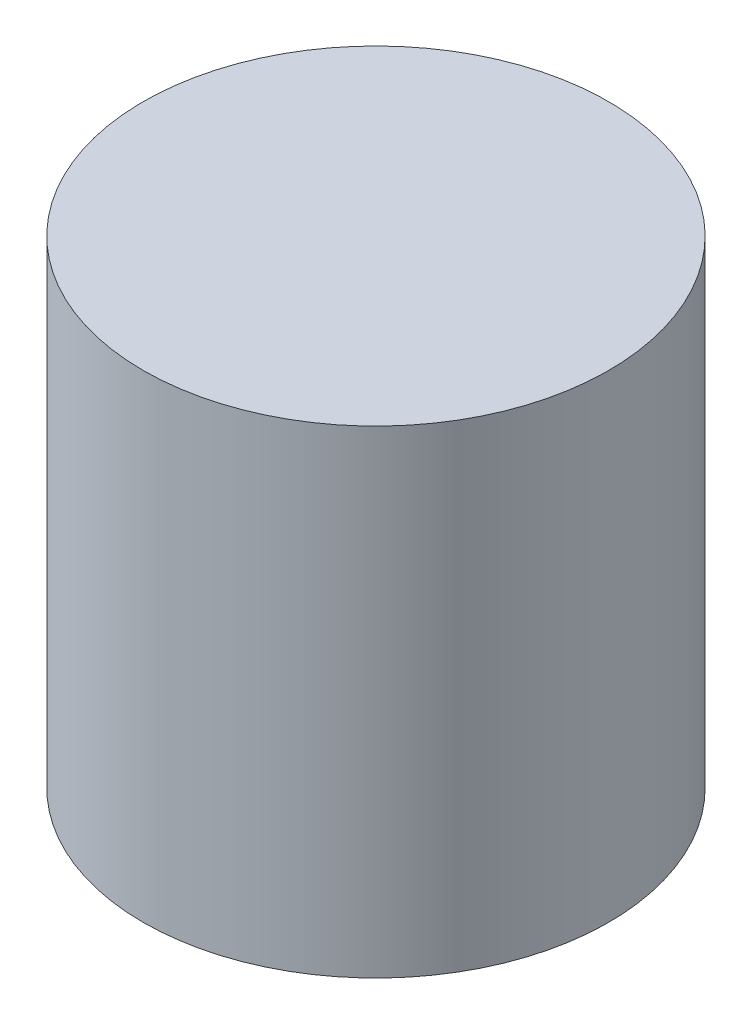
ISO-10303-21;
HEADER;
FILE_DESCRIPTION(('STEP AP214'),'2;1');
FILE_NAME('part.step','',(''),(''),'','','');
FILE_SCHEMA(('AUTOMOTIVE_DESIGN { 1 0 10303 214 1 1 1 1 }'));
ENDSEC;
DATA;
#1=APPLICATION_CONTEXT('core data for automotive mechanical design processes');
#2=APPLICATION_PROTOCOL_DEFINITION('international standard','automotive_design',2000,#1);
#3=PRODUCT_CONTEXT('',#1,'mechanical');
#4=PRODUCT('Part','Part','',(#3));
#5=PRODUCT_RELATED_PRODUCT_CATEGORY('part','',(#4));
#6=PRODUCT_DEFINITION_FORMATION('','',#4);
#7=PRODUCT_DEFINITION_CONTEXT('part definition',#1,'design');
#8=PRODUCT_DEFINITION('design','',#6,#7);
#9=PRODUCT_DEFINITION_SHAPE('','',#8);
#10=(LENGTH_UNIT() NAMED_UNIT(*) SI_UNIT(.MILLI.,.METRE.));
#11=(NAMED_UNIT(*) PLANE_ANGLE_UNIT() SI_UNIT($,.RADIAN.));
#12=(NAMED_UNIT(*) SI_UNIT($,.STERADIAN.) SOLID_ANGLE_UNIT());
#13=UNCERTAINTY_MEASURE_WITH_UNIT(LENGTH_MEASURE(1.E-05),#10,'distance_accuracy_value','');
#14=(GEOMETRIC_REPRESENTATION_CONTEXT(3) GLOBAL_UNCERTAINTY_ASSIGNED_CONTEXT((#13)) GLOBAL_UNIT_ASSIGNED_CONTEXT((#10,
#11,#12)) REPRESENTATION_CONTEXT('',''));
#15=CARTESIAN_POINT('',(0.,0.,0.));
#16=DIRECTION('',(0.,0.,1.));
#17=DIRECTION('',(1.,0.,0.));
#18=AXIS2_PLACEMENT_3D('',#15,#16,#17);
#19=CARTESIAN_POINT('',(0.,584.2,0.));
#20=DIRECTION('',(0.,-1.,0.));
#21=DIRECTION('',(0.,0.,-1.));
#22=AXIS2_PLACEMENT_3D('',#19,#20,#21);
#23=CYLINDRICAL_SURFACE('',#22,284.48000000009);
#24=CARTESIAN_POINT('',(0.,584.2,0.));
#25=DIRECTION('',(0.,1.,0.));
#26=DIRECTION('',(0.,0.,1.));
#27=AXIS2_PLACEMENT_3D('',#24,#25,#26);
#28=CIRCLE('',#27,284.48000000009);
#29=CARTESIAN_POINT('',(0.,584.2,284.48000000009));
#30=VERTEX_POINT('',#29);
#31=EDGE_CURVE('E10',#30,#30,#28,.T.);
#32=ORIENTED_EDGE('',*,*,#31,.F.);
#33=EDGE_LOOP('',(#32));
#34=FACE_BOUND('',#33,.T.);
#35=CARTESIAN_POINT('',(0.,0.,0.));
#36=DIRECTION('',(0.,1.,0.));
#37=DIRECTION('',(0.,0.,1.));
#38=AXIS2_PLACEMENT_3D('',#35,#36,#37);
#39=CIRCLE('',#38,284.48000000009);
#40=CARTESIAN_POINT('',(0.,0.,284.48000000009));
#41=VERTEX_POINT('',#40);
#42=EDGE_CURVE('E38',#41,#41,#39,.T.);
#43=ORIENTED_EDGE('',*,*,#42,.T.);
#44=EDGE_LOOP('',(#43));
#45=FACE_BOUND('',#44,.T.);
#46=ADVANCED_FACE('F35',(#34,#45),#23,.T.);
#47=CARTESIAN_POINT('',(0.,584.2,0.));
#48=DIRECTION('',(0.,1.,0.));
#49=DIRECTION('',(0.,0.,1.));
#50=AXIS2_PLACEMENT_3D('',#47,#48,#49);
#51=PLANE('',#50);
#52=ORIENTED_EDGE('',*,*,#31,.T.);
#53=EDGE_LOOP('',(#52));
#54=FACE_BOUND('',#53,.T.);
#55=ADVANCED_FACE('F64',(#54),#51,.T.);
#56=CARTESIAN_POINT('',(0.,0.,0.));
#57=DIRECTION('',(0.,1.,0.));
#58=DIRECTION('',(0.,0.,1.));
#59=AXIS2_PLACEMENT_3D('',#56,#57,#58);
#60=PLANE('',#59);
#61=CARTESIAN_POINT('',(0.,0.,0.));
#62=DIRECTION('',(0.,-1.,0.));
#63=DIRECTION('',(0.,0.,-1.));
#64=AXIS2_PLACEMENT_3D('',#61,#62,#63);
#65=CIRCLE('',#64,279.4);
#66=CARTESIAN_POINT('',(0.,0.,-279.4));
#67=VERTEX_POINT('',#66);
#68=EDGE_CURVE('E47',#67,#67,#65,.T.);
#69=ORIENTED_EDGE('',*,*,#68,.F.);
#70=EDGE_LOOP('',(#69));
#71=FACE_BOUND('',#70,.T.);
#72=ORIENTED_EDGE('',*,*,#42,.F.);
#73=EDGE_LOOP('',(#72));
#74=FACE_BOUND('',#73,.T.);
#75=ADVANCED_FACE('F58',(#71,#74),#60,.F.);
#76=CARTESIAN_POINT('',(0.,558.8,0.));
#77=DIRECTION('',(0.,-1.,0.));
#78=DIRECTION('',(0.,0.,-1.));
#79=AXIS2_PLACEMENT_3D('',#76,#77,#78);
#80=CYLINDRICAL_SURFACE('',#79,279.4);
#81=CARTESIAN_POINT('',(0.,558.8,0.));
#82=DIRECTION('',(0.,-1.,0.));
#83=DIRECTION('',(0.,0.,-1.));
#84=AXIS2_PLACEMENT_3D('',#81,#82,#83);
#85=CIRCLE('',#84,279.4);
#86=CARTESIAN_POINT('',(0.,558.8,-279.4));
#87=VERTEX_POINT('',#86);
#88=EDGE_CURVE('E45',#87,#87,#85,.T.);
#89=ORIENTED_EDGE('',*,*,#88,.F.);
#90=EDGE_LOOP('',(#89));
#91=FACE_BOUND('',#90,.T.);
#92=ORIENTED_EDGE('',*,*,#68,.T.);
#93=EDGE_LOOP('',(#92));
#94=FACE_BOUND('',#93,.T.);
#95=ADVANCED_FACE('F55',(#91,#94),#80,.F.);
#96=CARTESIAN_POINT('',(0.,558.8,0.));
#97=DIRECTION('',(0.,-1.,0.));
#98=DIRECTION('',(0.,0.,-1.));
#99=AXIS2_PLACEMENT_3D('',#96,#97,#98);
#100=PLANE('',#99);
#101=ORIENTED_EDGE('',*,*,#88,.T.);
#102=EDGE_LOOP('',(#101));
#103=FACE_BOUND('',#102,.T.);
#104=ADVANCED_FACE('F53',(#103),#100,.T.);
#105=CLOSED_SHELL('',(#46,#55,#75,#95,#104));
#106=MANIFOLD_SOLID_BREP('B2',#105);
#107=ADVANCED_BREP_SHAPE_REPRESENTATION('',(#18,#106),#14);
#108=SHAPE_DEFINITION_REPRESENTATION(#9,#107);
ENDSEC;
END-ISO-10303-21;
